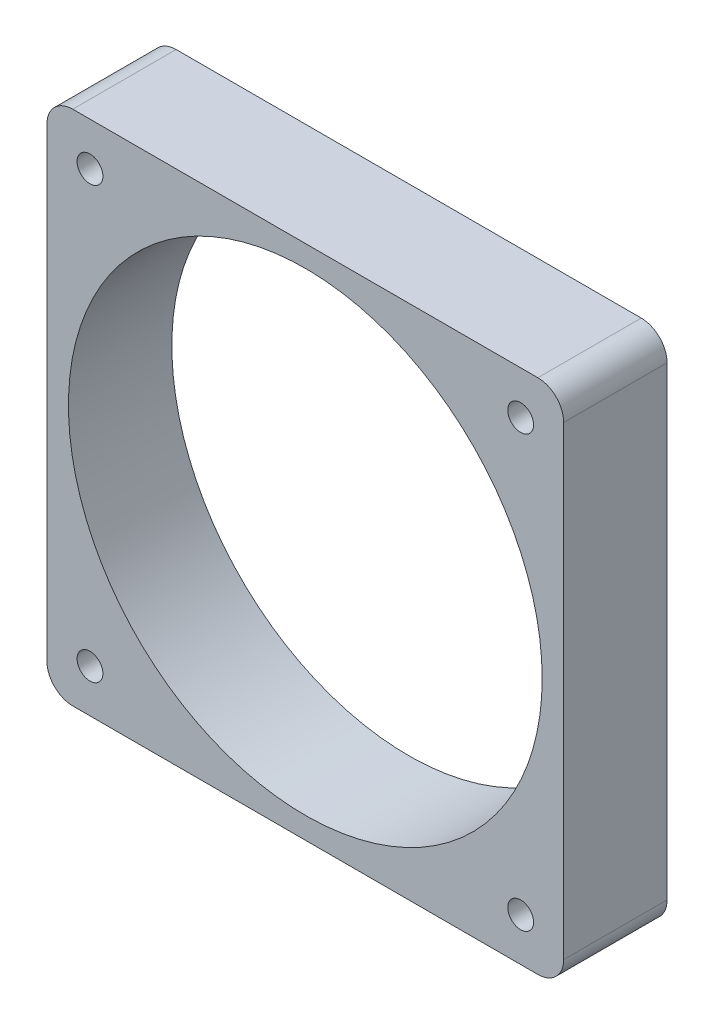
ISO-10303-21;
HEADER;
FILE_DESCRIPTION(('STEP AP214'),'2;1');
FILE_NAME('part.step','',(''),(''),'','','');
FILE_SCHEMA(('AUTOMOTIVE_DESIGN { 1 0 10303 214 1 1 1 1 }'));
ENDSEC;
DATA;
#1=APPLICATION_CONTEXT('core data for automotive mechanical design processes');
#2=APPLICATION_PROTOCOL_DEFINITION('international standard','automotive_design',2000,#1);
#3=PRODUCT_CONTEXT('',#1,'mechanical');
#4=PRODUCT('Part','Part','',(#3));
#5=PRODUCT_RELATED_PRODUCT_CATEGORY('part','',(#4));
#6=PRODUCT_DEFINITION_FORMATION('','',#4);
#7=PRODUCT_DEFINITION_CONTEXT('part definition',#1,'design');
#8=PRODUCT_DEFINITION('design','',#6,#7);
#9=PRODUCT_DEFINITION_SHAPE('','',#8);
#10=(LENGTH_UNIT() NAMED_UNIT(*) SI_UNIT(.MILLI.,.METRE.));
#11=(NAMED_UNIT(*) PLANE_ANGLE_UNIT() SI_UNIT($,.RADIAN.));
#12=(NAMED_UNIT(*) SI_UNIT($,.STERADIAN.) SOLID_ANGLE_UNIT());
#13=UNCERTAINTY_MEASURE_WITH_UNIT(LENGTH_MEASURE(1.E-05),#10,'distance_accuracy_value','');
#14=(GEOMETRIC_REPRESENTATION_CONTEXT(3) GLOBAL_UNCERTAINTY_ASSIGNED_CONTEXT((#13)) GLOBAL_UNIT_ASSIGNED_CONTEXT((#10,
#11,#12)) REPRESENTATION_CONTEXT('',''));
#15=CARTESIAN_POINT('',(0.,0.,0.));
#16=DIRECTION('',(0.,0.,1.));
#17=DIRECTION('',(1.,0.,0.));
#18=AXIS2_PLACEMENT_3D('',#15,#16,#17);
#19=CARTESIAN_POINT('',(0.,0.,12.));
#20=DIRECTION('',(0.,0.,1.));
#21=DIRECTION('',(1.,0.,0.));
#22=AXIS2_PLACEMENT_3D('',#19,#20,#21);
#23=PLANE('',#22);
#24=CARTESIAN_POINT('',(-19.6666666666667,-33.,12.));
#25=DIRECTION('',(0.,0.,1.));
#26=DIRECTION('',(1.,0.,0.));
#27=AXIS2_PLACEMENT_3D('',#24,#25,#26);
#28=CIRCLE('',#27,1.5);
#29=CARTESIAN_POINT('',(-18.1666666666667,-33.,12.));
#30=VERTEX_POINT('',#29);
#31=EDGE_CURVE('E192',#30,#30,#28,.T.);
#32=ORIENTED_EDGE('',*,*,#31,.F.);
#33=EDGE_LOOP('',(#32));
#34=FACE_BOUND('',#33,.T.);
#35=CARTESIAN_POINT('',(-19.6666666666667,17.,12.));
#36=DIRECTION('',(0.,0.,1.));
#37=DIRECTION('',(1.,0.,0.));
#38=AXIS2_PLACEMENT_3D('',#35,#36,#37);
#39=CIRCLE('',#38,1.5);
#40=CARTESIAN_POINT('',(-18.1666666666667,17.,12.));
#41=VERTEX_POINT('',#40);
#42=EDGE_CURVE('E180',#41,#41,#39,.T.);
#43=ORIENTED_EDGE('',*,*,#42,.F.);
#44=EDGE_LOOP('',(#43));
#45=FACE_BOUND('',#44,.T.);
#46=DIRECTION('',(0.,-1.,0.));
#47=VECTOR('',#46,1.);
#48=CARTESIAN_POINT('',(-24.6666666666667,22.,12.));
#49=LINE('',#48,#47);
#50=CARTESIAN_POINT('',(-24.6666666666667,19.,12.));
#51=VERTEX_POINT('',#50);
#52=CARTESIAN_POINT('',(-24.6666666666667,-35.,12.));
#53=VERTEX_POINT('',#52);
#54=EDGE_CURVE('E137',#51,#53,#49,.T.);
#55=ORIENTED_EDGE('',*,*,#54,.T.);
#56=CARTESIAN_POINT('',(-21.6666666666667,-35.,12.));
#57=DIRECTION('',(0.,0.,1.));
#58=DIRECTION('',(1.,0.,0.));
#59=AXIS2_PLACEMENT_3D('',#56,#57,#58);
#60=CIRCLE('',#59,3.);
#61=CARTESIAN_POINT('',(-21.6666666666667,-38.,12.));
#62=VERTEX_POINT('',#61);
#63=EDGE_CURVE('E152',#53,#62,#60,.T.);
#64=ORIENTED_EDGE('',*,*,#63,.T.);
#65=DIRECTION('',(1.,0.,0.));
#66=VECTOR('',#65,1.);
#67=CARTESIAN_POINT('',(-24.6666666666667,-38.,12.));
#68=LINE('',#67,#66);
#69=CARTESIAN_POINT('',(32.3333333333333,-38.,12.));
#70=VERTEX_POINT('',#69);
#71=EDGE_CURVE('E119',#62,#70,#68,.T.);
#72=ORIENTED_EDGE('',*,*,#71,.T.);
#73=CARTESIAN_POINT('',(32.3333333333333,-35.,12.));
#74=DIRECTION('',(0.,0.,1.));
#75=DIRECTION('',(1.,0.,0.));
#76=AXIS2_PLACEMENT_3D('',#73,#74,#75);
#77=CIRCLE('',#76,3.);
#78=CARTESIAN_POINT('',(35.3333333333334,-35.,12.));
#79=VERTEX_POINT('',#78);
#80=EDGE_CURVE('E150',#70,#79,#77,.T.);
#81=ORIENTED_EDGE('',*,*,#80,.T.);
#82=DIRECTION('',(0.,1.,0.));
#83=VECTOR('',#82,1.);
#84=CARTESIAN_POINT('',(35.3333333333333,22.,12.));
#85=LINE('',#84,#83);
#86=CARTESIAN_POINT('',(35.3333333333333,19.,12.));
#87=VERTEX_POINT('',#86);
#88=EDGE_CURVE('E163',#79,#87,#85,.T.);
#89=ORIENTED_EDGE('',*,*,#88,.T.);
#90=CARTESIAN_POINT('',(32.3333333333333,19.,12.));
#91=DIRECTION('',(0.,0.,1.));
#92=DIRECTION('',(1.,0.,0.));
#93=AXIS2_PLACEMENT_3D('',#90,#91,#92);
#94=CIRCLE('',#93,3.);
#95=CARTESIAN_POINT('',(32.3333333333333,22.,12.));
#96=VERTEX_POINT('',#95);
#97=EDGE_CURVE('E54',#87,#96,#94,.T.);
#98=ORIENTED_EDGE('',*,*,#97,.T.);
#99=DIRECTION('',(-1.,0.,0.));
#100=VECTOR('',#99,1.);
#101=CARTESIAN_POINT('',(-24.6666666666667,22.,12.));
#102=LINE('',#101,#100);
#103=CARTESIAN_POINT('',(-21.6666666666667,22.,12.));
#104=VERTEX_POINT('',#103);
#105=EDGE_CURVE('E138',#96,#104,#102,.T.);
#106=ORIENTED_EDGE('',*,*,#105,.T.);
#107=CARTESIAN_POINT('',(-21.6666666666667,19.,12.));
#108=DIRECTION('',(0.,0.,1.));
#109=DIRECTION('',(1.,0.,0.));
#110=AXIS2_PLACEMENT_3D('',#107,#108,#109);
#111=CIRCLE('',#110,3.);
#112=EDGE_CURVE('E147',#104,#51,#111,.T.);
#113=ORIENTED_EDGE('',*,*,#112,.T.);
#114=EDGE_LOOP('',(#55,#64,#72,#81,#89,#98,#106,#113));
#115=FACE_BOUND('',#114,.T.);
#116=CARTESIAN_POINT('',(5.33333333333334,-8.,12.));
#117=DIRECTION('',(0.,0.,1.));
#118=DIRECTION('',(1.,0.,0.));
#119=AXIS2_PLACEMENT_3D('',#116,#117,#118);
#120=CIRCLE('',#119,27.5);
#121=CARTESIAN_POINT('',(32.8333333333333,-8.,12.));
#122=VERTEX_POINT('',#121);
#123=EDGE_CURVE('E132',#122,#122,#120,.T.);
#124=ORIENTED_EDGE('',*,*,#123,.F.);
#125=EDGE_LOOP('',(#124));
#126=FACE_BOUND('',#125,.T.);
#127=CARTESIAN_POINT('',(30.3333333333333,17.,12.));
#128=DIRECTION('',(0.,0.,1.));
#129=DIRECTION('',(1.,0.,0.));
#130=AXIS2_PLACEMENT_3D('',#127,#128,#129);
#131=CIRCLE('',#130,1.50000000000001);
#132=CARTESIAN_POINT('',(31.8333333333334,17.,12.));
#133=VERTEX_POINT('',#132);
#134=EDGE_CURVE('E186',#133,#133,#131,.T.);
#135=ORIENTED_EDGE('',*,*,#134,.F.);
#136=EDGE_LOOP('',(#135));
#137=FACE_BOUND('',#136,.T.);
#138=CARTESIAN_POINT('',(30.3333333333333,-33.,12.));
#139=DIRECTION('',(0.,0.,1.));
#140=DIRECTION('',(1.,0.,0.));
#141=AXIS2_PLACEMENT_3D('',#138,#139,#140);
#142=CIRCLE('',#141,1.50000000000001);
#143=CARTESIAN_POINT('',(31.8333333333334,-33.,12.));
#144=VERTEX_POINT('',#143);
#145=EDGE_CURVE('E198',#144,#144,#142,.T.);
#146=ORIENTED_EDGE('',*,*,#145,.F.);
#147=EDGE_LOOP('',(#146));
#148=FACE_BOUND('',#147,.T.);
#149=ADVANCED_FACE('F33',(#34,#45,#115,#126,#137,#148),#23,.T.);
#150=CARTESIAN_POINT('',(0.,0.,0.));
#151=DIRECTION('',(0.,0.,1.));
#152=DIRECTION('',(1.,0.,0.));
#153=AXIS2_PLACEMENT_3D('',#150,#151,#152);
#154=PLANE('',#153);
#155=DIRECTION('',(1.,0.,0.));
#156=VECTOR('',#155,1.);
#157=CARTESIAN_POINT('',(-24.6666666666667,-38.,0.));
#158=LINE('',#157,#156);
#159=CARTESIAN_POINT('',(-21.6666666666667,-38.,0.));
#160=VERTEX_POINT('',#159);
#161=CARTESIAN_POINT('',(32.3333333333333,-38.,0.));
#162=VERTEX_POINT('',#161);
#163=EDGE_CURVE('E116',#160,#162,#158,.T.);
#164=ORIENTED_EDGE('',*,*,#163,.F.);
#165=CARTESIAN_POINT('',(-21.6666666666667,-35.,0.));
#166=DIRECTION('',(0.,0.,1.));
#167=DIRECTION('',(1.,0.,0.));
#168=AXIS2_PLACEMENT_3D('',#165,#166,#167);
#169=CIRCLE('',#168,3.);
#170=CARTESIAN_POINT('',(-24.6666666666667,-35.,0.));
#171=VERTEX_POINT('',#170);
#172=EDGE_CURVE('E99',#160,#171,#169,.F.);
#173=ORIENTED_EDGE('',*,*,#172,.T.);
#174=DIRECTION('',(0.,-1.,0.));
#175=VECTOR('',#174,1.);
#176=CARTESIAN_POINT('',(-24.6666666666667,22.,0.));
#177=LINE('',#176,#175);
#178=CARTESIAN_POINT('',(-24.6666666666667,19.,0.));
#179=VERTEX_POINT('',#178);
#180=EDGE_CURVE('E127',#179,#171,#177,.T.);
#181=ORIENTED_EDGE('',*,*,#180,.F.);
#182=CARTESIAN_POINT('',(-21.6666666666667,19.,0.));
#183=DIRECTION('',(0.,0.,1.));
#184=DIRECTION('',(1.,0.,0.));
#185=AXIS2_PLACEMENT_3D('',#182,#183,#184);
#186=CIRCLE('',#185,3.);
#187=CARTESIAN_POINT('',(-21.6666666666667,22.,0.));
#188=VERTEX_POINT('',#187);
#189=EDGE_CURVE('E120',#179,#188,#186,.F.);
#190=ORIENTED_EDGE('',*,*,#189,.T.);
#191=DIRECTION('',(-1.,0.,0.));
#192=VECTOR('',#191,1.);
#193=CARTESIAN_POINT('',(-24.6666666666667,22.,0.));
#194=LINE('',#193,#192);
#195=CARTESIAN_POINT('',(32.3333333333333,22.,0.));
#196=VERTEX_POINT('',#195);
#197=EDGE_CURVE('E130',#196,#188,#194,.T.);
#198=ORIENTED_EDGE('',*,*,#197,.F.);
#199=CARTESIAN_POINT('',(32.3333333333333,19.,0.));
#200=DIRECTION('',(0.,0.,1.));
#201=DIRECTION('',(1.,0.,0.));
#202=AXIS2_PLACEMENT_3D('',#199,#200,#201);
#203=CIRCLE('',#202,3.);
#204=CARTESIAN_POINT('',(35.3333333333333,19.,0.));
#205=VERTEX_POINT('',#204);
#206=EDGE_CURVE('E141',#196,#205,#203,.F.);
#207=ORIENTED_EDGE('',*,*,#206,.T.);
#208=DIRECTION('',(0.,1.,0.));
#209=VECTOR('',#208,1.);
#210=CARTESIAN_POINT('',(35.3333333333333,22.,0.));
#211=LINE('',#210,#209);
#212=CARTESIAN_POINT('',(35.3333333333334,-35.,0.));
#213=VERTEX_POINT('',#212);
#214=EDGE_CURVE('E126',#213,#205,#211,.T.);
#215=ORIENTED_EDGE('',*,*,#214,.F.);
#216=CARTESIAN_POINT('',(32.3333333333333,-35.,0.));
#217=DIRECTION('',(0.,0.,1.));
#218=DIRECTION('',(1.,0.,0.));
#219=AXIS2_PLACEMENT_3D('',#216,#217,#218);
#220=CIRCLE('',#219,3.);
#221=EDGE_CURVE('E110',#213,#162,#220,.F.);
#222=ORIENTED_EDGE('',*,*,#221,.T.);
#223=EDGE_LOOP('',(#164,#173,#181,#190,#198,#207,#215,#222));
#224=FACE_BOUND('',#223,.T.);
#225=CARTESIAN_POINT('',(5.33333333333334,-8.,0.));
#226=DIRECTION('',(0.,0.,1.));
#227=DIRECTION('',(1.,0.,0.));
#228=AXIS2_PLACEMENT_3D('',#225,#226,#227);
#229=CIRCLE('',#228,27.5);
#230=CARTESIAN_POINT('',(32.8333333333333,-8.,0.));
#231=VERTEX_POINT('',#230);
#232=EDGE_CURVE('E177',#231,#231,#229,.T.);
#233=ORIENTED_EDGE('',*,*,#232,.T.);
#234=EDGE_LOOP('',(#233));
#235=FACE_BOUND('',#234,.T.);
#236=CARTESIAN_POINT('',(-19.6666666666667,17.,0.));
#237=DIRECTION('',(0.,0.,1.));
#238=DIRECTION('',(1.,0.,0.));
#239=AXIS2_PLACEMENT_3D('',#236,#237,#238);
#240=CIRCLE('',#239,1.5);
#241=CARTESIAN_POINT('',(-18.1666666666667,17.,0.));
#242=VERTEX_POINT('',#241);
#243=EDGE_CURVE('E183',#242,#242,#240,.T.);
#244=ORIENTED_EDGE('',*,*,#243,.T.);
#245=EDGE_LOOP('',(#244));
#246=FACE_BOUND('',#245,.T.);
#247=CARTESIAN_POINT('',(30.3333333333333,17.,0.));
#248=DIRECTION('',(0.,0.,1.));
#249=DIRECTION('',(1.,0.,0.));
#250=AXIS2_PLACEMENT_3D('',#247,#248,#249);
#251=CIRCLE('',#250,1.50000000000001);
#252=CARTESIAN_POINT('',(31.8333333333334,17.,0.));
#253=VERTEX_POINT('',#252);
#254=EDGE_CURVE('E189',#253,#253,#251,.T.);
#255=ORIENTED_EDGE('',*,*,#254,.T.);
#256=EDGE_LOOP('',(#255));
#257=FACE_BOUND('',#256,.T.);
#258=CARTESIAN_POINT('',(-19.6666666666667,-33.,0.));
#259=DIRECTION('',(0.,0.,1.));
#260=DIRECTION('',(1.,0.,0.));
#261=AXIS2_PLACEMENT_3D('',#258,#259,#260);
#262=CIRCLE('',#261,1.5);
#263=CARTESIAN_POINT('',(-18.1666666666667,-33.,0.));
#264=VERTEX_POINT('',#263);
#265=EDGE_CURVE('E195',#264,#264,#262,.T.);
#266=ORIENTED_EDGE('',*,*,#265,.T.);
#267=EDGE_LOOP('',(#266));
#268=FACE_BOUND('',#267,.T.);
#269=CARTESIAN_POINT('',(30.3333333333333,-33.,0.));
#270=DIRECTION('',(0.,0.,1.));
#271=DIRECTION('',(1.,0.,0.));
#272=AXIS2_PLACEMENT_3D('',#269,#270,#271);
#273=CIRCLE('',#272,1.50000000000001);
#274=CARTESIAN_POINT('',(31.8333333333334,-33.,0.));
#275=VERTEX_POINT('',#274);
#276=EDGE_CURVE('E201',#275,#275,#273,.T.);
#277=ORIENTED_EDGE('',*,*,#276,.T.);
#278=EDGE_LOOP('',(#277));
#279=FACE_BOUND('',#278,.T.);
#280=ADVANCED_FACE('F123',(#224,#235,#246,#257,#268,#279),#154,.F.);
#281=CARTESIAN_POINT('',(-24.6666666666667,22.,12.));
#282=DIRECTION('',(1.,0.,0.));
#283=DIRECTION('',(0.,1.,0.));
#284=AXIS2_PLACEMENT_3D('',#281,#282,#283);
#285=PLANE('',#284);
#286=ORIENTED_EDGE('',*,*,#180,.T.);
#287=DIRECTION('',(0.,0.,-1.));
#288=VECTOR('',#287,1.);
#289=CARTESIAN_POINT('',(-24.6666666666667,-35.,12.));
#290=LINE('',#289,#288);
#291=EDGE_CURVE('E104',#171,#53,#290,.F.);
#292=ORIENTED_EDGE('',*,*,#291,.T.);
#293=ORIENTED_EDGE('',*,*,#54,.F.);
#294=DIRECTION('',(0.,0.,-1.));
#295=VECTOR('',#294,1.);
#296=CARTESIAN_POINT('',(-24.6666666666667,19.,12.));
#297=LINE('',#296,#295);
#298=EDGE_CURVE('E109',#51,#179,#297,.T.);
#299=ORIENTED_EDGE('',*,*,#298,.T.);
#300=EDGE_LOOP('',(#286,#292,#293,#299));
#301=FACE_BOUND('',#300,.T.);
#302=ADVANCED_FACE('F216',(#301),#285,.F.);
#303=CARTESIAN_POINT('',(-24.6666666666667,-38.,12.));
#304=DIRECTION('',(0.,1.,0.));
#305=DIRECTION('',(0.,0.,1.));
#306=AXIS2_PLACEMENT_3D('',#303,#304,#305);
#307=PLANE('',#306);
#308=ORIENTED_EDGE('',*,*,#71,.F.);
#309=DIRECTION('',(0.,0.,-1.));
#310=VECTOR('',#309,1.);
#311=CARTESIAN_POINT('',(-21.6666666666667,-38.,12.));
#312=LINE('',#311,#310);
#313=EDGE_CURVE('E103',#62,#160,#312,.T.);
#314=ORIENTED_EDGE('',*,*,#313,.T.);
#315=ORIENTED_EDGE('',*,*,#163,.T.);
#316=DIRECTION('',(0.,0.,-1.));
#317=VECTOR('',#316,1.);
#318=CARTESIAN_POINT('',(32.3333333333333,-38.,12.));
#319=LINE('',#318,#317);
#320=EDGE_CURVE('E121',#162,#70,#319,.F.);
#321=ORIENTED_EDGE('',*,*,#320,.T.);
#322=EDGE_LOOP('',(#308,#314,#315,#321));
#323=FACE_BOUND('',#322,.T.);
#324=ADVANCED_FACE('F115',(#323),#307,.F.);
#325=CARTESIAN_POINT('',(35.3333333333333,22.,12.));
#326=DIRECTION('',(-1.,0.,0.));
#327=DIRECTION('',(0.,-1.,0.));
#328=AXIS2_PLACEMENT_3D('',#325,#326,#327);
#329=PLANE('',#328);
#330=ORIENTED_EDGE('',*,*,#88,.F.);
#331=DIRECTION('',(0.,0.,-1.));
#332=VECTOR('',#331,1.);
#333=CARTESIAN_POINT('',(35.3333333333334,-35.,12.));
#334=LINE('',#333,#332);
#335=EDGE_CURVE('E156',#79,#213,#334,.T.);
#336=ORIENTED_EDGE('',*,*,#335,.T.);
#337=ORIENTED_EDGE('',*,*,#214,.T.);
#338=DIRECTION('',(0.,0.,-1.));
#339=VECTOR('',#338,1.);
#340=CARTESIAN_POINT('',(35.3333333333333,19.,12.));
#341=LINE('',#340,#339);
#342=EDGE_CURVE('E154',#205,#87,#341,.F.);
#343=ORIENTED_EDGE('',*,*,#342,.T.);
#344=EDGE_LOOP('',(#330,#336,#337,#343));
#345=FACE_BOUND('',#344,.T.);
#346=ADVANCED_FACE('F161',(#345),#329,.F.);
#347=CARTESIAN_POINT('',(-24.6666666666667,22.,12.));
#348=DIRECTION('',(0.,-1.,0.));
#349=DIRECTION('',(0.,0.,-1.));
#350=AXIS2_PLACEMENT_3D('',#347,#348,#349);
#351=PLANE('',#350);
#352=ORIENTED_EDGE('',*,*,#105,.F.);
#353=DIRECTION('',(0.,0.,-1.));
#354=VECTOR('',#353,1.);
#355=CARTESIAN_POINT('',(32.3333333333333,22.,12.));
#356=LINE('',#355,#354);
#357=EDGE_CURVE('E11',#96,#196,#356,.T.);
#358=ORIENTED_EDGE('',*,*,#357,.T.);
#359=ORIENTED_EDGE('',*,*,#197,.T.);
#360=DIRECTION('',(0.,0.,-1.));
#361=VECTOR('',#360,1.);
#362=CARTESIAN_POINT('',(-21.6666666666667,22.,12.));
#363=LINE('',#362,#361);
#364=EDGE_CURVE('E41',#188,#104,#363,.F.);
#365=ORIENTED_EDGE('',*,*,#364,.T.);
#366=EDGE_LOOP('',(#352,#358,#359,#365));
#367=FACE_BOUND('',#366,.T.);
#368=ADVANCED_FACE('F170',(#367),#351,.F.);
#369=CARTESIAN_POINT('',(5.33333333333334,-8.,12.));
#370=DIRECTION('',(0.,0.,-1.));
#371=DIRECTION('',(-1.,0.,0.));
#372=AXIS2_PLACEMENT_3D('',#369,#370,#371);
#373=CYLINDRICAL_SURFACE('',#372,27.5);
#374=ORIENTED_EDGE('',*,*,#123,.T.);
#375=EDGE_LOOP('',(#374));
#376=FACE_BOUND('',#375,.T.);
#377=ORIENTED_EDGE('',*,*,#232,.F.);
#378=EDGE_LOOP('',(#377));
#379=FACE_BOUND('',#378,.T.);
#380=ADVANCED_FACE('F221',(#376,#379),#373,.F.);
#381=CARTESIAN_POINT('',(-19.6666666666667,17.,12.));
#382=DIRECTION('',(0.,0.,-1.));
#383=DIRECTION('',(-1.,0.,0.));
#384=AXIS2_PLACEMENT_3D('',#381,#382,#383);
#385=CYLINDRICAL_SURFACE('',#384,1.5);
#386=ORIENTED_EDGE('',*,*,#42,.T.);
#387=EDGE_LOOP('',(#386));
#388=FACE_BOUND('',#387,.T.);
#389=ORIENTED_EDGE('',*,*,#243,.F.);
#390=EDGE_LOOP('',(#389));
#391=FACE_BOUND('',#390,.T.);
#392=ADVANCED_FACE('F255',(#388,#391),#385,.F.);
#393=CARTESIAN_POINT('',(30.3333333333333,17.,12.));
#394=DIRECTION('',(0.,0.,-1.));
#395=DIRECTION('',(-1.,0.,0.));
#396=AXIS2_PLACEMENT_3D('',#393,#394,#395);
#397=CYLINDRICAL_SURFACE('',#396,1.50000000000001);
#398=ORIENTED_EDGE('',*,*,#134,.T.);
#399=EDGE_LOOP('',(#398));
#400=FACE_BOUND('',#399,.T.);
#401=ORIENTED_EDGE('',*,*,#254,.F.);
#402=EDGE_LOOP('',(#401));
#403=FACE_BOUND('',#402,.T.);
#404=ADVANCED_FACE('F251',(#400,#403),#397,.F.);
#405=CARTESIAN_POINT('',(-19.6666666666667,-33.,12.));
#406=DIRECTION('',(0.,0.,-1.));
#407=DIRECTION('',(-1.,0.,0.));
#408=AXIS2_PLACEMENT_3D('',#405,#406,#407);
#409=CYLINDRICAL_SURFACE('',#408,1.5);
#410=ORIENTED_EDGE('',*,*,#31,.T.);
#411=EDGE_LOOP('',(#410));
#412=FACE_BOUND('',#411,.T.);
#413=ORIENTED_EDGE('',*,*,#265,.F.);
#414=EDGE_LOOP('',(#413));
#415=FACE_BOUND('',#414,.T.);
#416=ADVANCED_FACE('F254',(#412,#415),#409,.F.);
#417=CARTESIAN_POINT('',(30.3333333333333,-33.,12.));
#418=DIRECTION('',(0.,0.,-1.));
#419=DIRECTION('',(-1.,0.,0.));
#420=AXIS2_PLACEMENT_3D('',#417,#418,#419);
#421=CYLINDRICAL_SURFACE('',#420,1.50000000000001);
#422=ORIENTED_EDGE('',*,*,#145,.T.);
#423=EDGE_LOOP('',(#422));
#424=FACE_BOUND('',#423,.T.);
#425=ORIENTED_EDGE('',*,*,#276,.F.);
#426=EDGE_LOOP('',(#425));
#427=FACE_BOUND('',#426,.T.);
#428=ADVANCED_FACE('F207',(#424,#427),#421,.F.);
#429=CARTESIAN_POINT('',(-21.6666666666667,-35.,12.));
#430=DIRECTION('',(0.,0.,-1.));
#431=DIRECTION('',(-1.,0.,0.));
#432=AXIS2_PLACEMENT_3D('',#429,#430,#431);
#433=CYLINDRICAL_SURFACE('',#432,3.);
#434=ORIENTED_EDGE('',*,*,#63,.F.);
#435=ORIENTED_EDGE('',*,*,#291,.F.);
#436=ORIENTED_EDGE('',*,*,#172,.F.);
#437=ORIENTED_EDGE('',*,*,#313,.F.);
#438=EDGE_LOOP('',(#434,#435,#436,#437));
#439=FACE_BOUND('',#438,.T.);
#440=ADVANCED_FACE('F102',(#439),#433,.T.);
#441=CARTESIAN_POINT('',(32.3333333333333,-35.,12.));
#442=DIRECTION('',(0.,0.,-1.));
#443=DIRECTION('',(-1.,0.,0.));
#444=AXIS2_PLACEMENT_3D('',#441,#442,#443);
#445=CYLINDRICAL_SURFACE('',#444,3.);
#446=ORIENTED_EDGE('',*,*,#80,.F.);
#447=ORIENTED_EDGE('',*,*,#320,.F.);
#448=ORIENTED_EDGE('',*,*,#221,.F.);
#449=ORIENTED_EDGE('',*,*,#335,.F.);
#450=EDGE_LOOP('',(#446,#447,#448,#449));
#451=FACE_BOUND('',#450,.T.);
#452=ADVANCED_FACE('F235',(#451),#445,.T.);
#453=CARTESIAN_POINT('',(32.3333333333333,19.,12.));
#454=DIRECTION('',(0.,0.,-1.));
#455=DIRECTION('',(-1.,0.,0.));
#456=AXIS2_PLACEMENT_3D('',#453,#454,#455);
#457=CYLINDRICAL_SURFACE('',#456,3.);
#458=ORIENTED_EDGE('',*,*,#97,.F.);
#459=ORIENTED_EDGE('',*,*,#342,.F.);
#460=ORIENTED_EDGE('',*,*,#206,.F.);
#461=ORIENTED_EDGE('',*,*,#357,.F.);
#462=EDGE_LOOP('',(#458,#459,#460,#461));
#463=FACE_BOUND('',#462,.T.);
#464=ADVANCED_FACE('F169',(#463),#457,.T.);
#465=CARTESIAN_POINT('',(-21.6666666666667,19.,12.));
#466=DIRECTION('',(0.,0.,-1.));
#467=DIRECTION('',(-1.,0.,0.));
#468=AXIS2_PLACEMENT_3D('',#465,#466,#467);
#469=CYLINDRICAL_SURFACE('',#468,3.);
#470=ORIENTED_EDGE('',*,*,#112,.F.);
#471=ORIENTED_EDGE('',*,*,#364,.F.);
#472=ORIENTED_EDGE('',*,*,#189,.F.);
#473=ORIENTED_EDGE('',*,*,#298,.F.);
#474=EDGE_LOOP('',(#470,#471,#472,#473));
#475=FACE_BOUND('',#474,.T.);
#476=ADVANCED_FACE('F35',(#475),#469,.T.);
#477=CLOSED_SHELL('',(#149,#280,#302,#324,#346,#368,#380,#392,#404,#416,#428,#440,#452,#464,#476));
#478=MANIFOLD_SOLID_BREP('B2',#477);
#479=ADVANCED_BREP_SHAPE_REPRESENTATION('',(#18,#478),#14);
#480=SHAPE_DEFINITION_REPRESENTATION(#9,#479);
ENDSEC;
END-ISO-10303-21;
